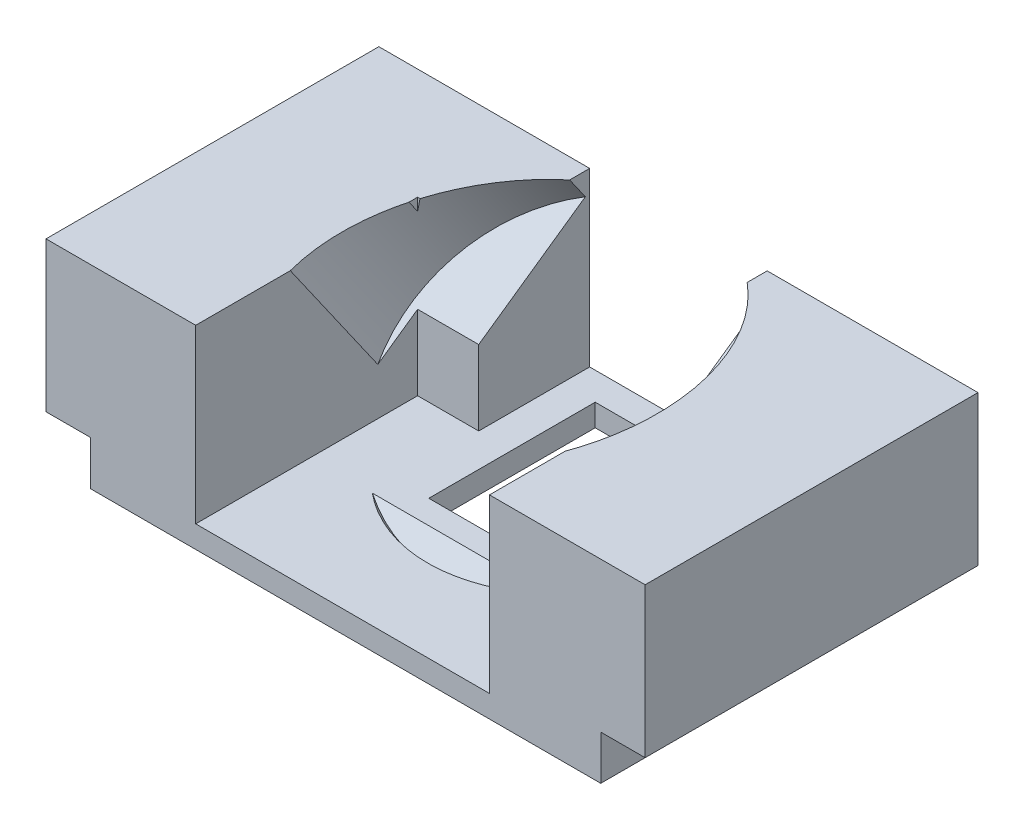
ISO-10303-21;
HEADER;
FILE_DESCRIPTION(('STEP AP214'),'2;1');
FILE_NAME('part.step','',(''),(''),'','','');
FILE_SCHEMA(('AUTOMOTIVE_DESIGN { 1 0 10303 214 1 1 1 1 }'));
ENDSEC;
DATA;
#1=APPLICATION_CONTEXT('core data for automotive mechanical design processes');
#2=APPLICATION_PROTOCOL_DEFINITION('international standard','automotive_design',2000,#1);
#3=PRODUCT_CONTEXT('',#1,'mechanical');
#4=PRODUCT('Part','Part','',(#3));
#5=PRODUCT_RELATED_PRODUCT_CATEGORY('part','',(#4));
#6=PRODUCT_DEFINITION_FORMATION('','',#4);
#7=PRODUCT_DEFINITION_CONTEXT('part definition',#1,'design');
#8=PRODUCT_DEFINITION('design','',#6,#7);
#9=PRODUCT_DEFINITION_SHAPE('','',#8);
#10=(LENGTH_UNIT() NAMED_UNIT(*) SI_UNIT(.MILLI.,.METRE.));
#11=(NAMED_UNIT(*) PLANE_ANGLE_UNIT() SI_UNIT($,.RADIAN.));
#12=(NAMED_UNIT(*) SI_UNIT($,.STERADIAN.) SOLID_ANGLE_UNIT());
#13=UNCERTAINTY_MEASURE_WITH_UNIT(LENGTH_MEASURE(1.E-05),#10,'distance_accuracy_value','');
#14=(GEOMETRIC_REPRESENTATION_CONTEXT(3) GLOBAL_UNCERTAINTY_ASSIGNED_CONTEXT((#13)) GLOBAL_UNIT_ASSIGNED_CONTEXT((#10,
#11,#12)) REPRESENTATION_CONTEXT('',''));
#15=CARTESIAN_POINT('',(0.,0.,0.));
#16=DIRECTION('',(0.,0.,1.));
#17=DIRECTION('',(1.,0.,0.));
#18=AXIS2_PLACEMENT_3D('',#15,#16,#17);
#19=CARTESIAN_POINT('',(34.29,11.1125,25.4));
#20=DIRECTION('',(0.,-1.,0.));
#21=DIRECTION('',(0.,0.,-1.));
#22=AXIS2_PLACEMENT_3D('',#19,#20,#21);
#23=PLANE('',#22);
#24=DIRECTION('',(0.,0.,-1.));
#25=VECTOR('',#24,1.);
#26=CARTESIAN_POINT('',(-17.1540385072498,11.1125,25.4));
#27=LINE('',#26,#25);
#28=CARTESIAN_POINT('',(-17.1540385072498,11.1125,25.4));
#29=VERTEX_POINT('',#28);
#30=CARTESIAN_POINT('',(-17.1540385072498,11.1125,14.5741067771752));
#31=VERTEX_POINT('',#30);
#32=EDGE_CURVE('E232',#29,#31,#27,.T.);
#33=ORIENTED_EDGE('',*,*,#32,.T.);
#34=CARTESIAN_POINT('',(0.,11.1125,7.78105626835542));
#35=DIRECTION('',(0.,-1.,0.));
#36=DIRECTION('',(0.,0.,-1.));
#37=AXIS2_PLACEMENT_3D('',#34,#35,#36);
#38=ELLIPSE('',#37,22.0154489337241,18.034);
#39=CARTESIAN_POINT('',(-17.1540385072498,11.1125,0.988005759535643));
#40=VERTEX_POINT('',#39);
#41=EDGE_CURVE('E367',#40,#31,#38,.F.);
#42=ORIENTED_EDGE('',*,*,#41,.F.);
#43=CARTESIAN_POINT('',(-17.1540385072498,11.1125,0.));
#44=VERTEX_POINT('',#43);
#45=EDGE_CURVE('E492',#40,#44,#27,.T.);
#46=ORIENTED_EDGE('',*,*,#45,.T.);
#47=DIRECTION('',(-1.,0.,0.));
#48=VECTOR('',#47,1.);
#49=CARTESIAN_POINT('',(-17.1540385072498,11.1125,0.));
#50=LINE('',#49,#48);
#51=CARTESIAN_POINT('',(-16.8700610793141,11.1125,0.));
#52=VERTEX_POINT('',#51);
#53=EDGE_CURVE('E233',#52,#44,#50,.T.);
#54=ORIENTED_EDGE('',*,*,#53,.F.);
#55=CARTESIAN_POINT('',(-10.16,11.1125,-10.4080572545341));
#56=VERTEX_POINT('',#55);
#57=EDGE_CURVE('E370',#56,#52,#38,.F.);
#58=ORIENTED_EDGE('',*,*,#57,.F.);
#59=DIRECTION('',(0.,0.,1.));
#60=VECTOR('',#59,1.);
#61=CARTESIAN_POINT('',(-10.16,11.1125,-25.4));
#62=LINE('',#61,#60);
#63=CARTESIAN_POINT('',(-10.16,11.1125,-12.7));
#64=VERTEX_POINT('',#63);
#65=EDGE_CURVE('E346',#64,#56,#62,.T.);
#66=ORIENTED_EDGE('',*,*,#65,.F.);
#67=DIRECTION('',(1.,0.,0.));
#68=VECTOR('',#67,1.);
#69=CARTESIAN_POINT('',(-34.29,11.1125,-12.7));
#70=LINE('',#69,#68);
#71=CARTESIAN_POINT('',(-34.29,11.1125,-12.7));
#72=VERTEX_POINT('',#71);
#73=EDGE_CURVE('E313',#72,#64,#70,.T.);
#74=ORIENTED_EDGE('',*,*,#73,.F.);
#75=DIRECTION('',(0.,0.,1.));
#76=VECTOR('',#75,1.);
#77=CARTESIAN_POINT('',(-34.29,11.1125,25.4));
#78=LINE('',#77,#76);
#79=CARTESIAN_POINT('',(-34.29,11.1125,25.4));
#80=VERTEX_POINT('',#79);
#81=EDGE_CURVE('E379',#72,#80,#78,.T.);
#82=ORIENTED_EDGE('',*,*,#81,.T.);
#83=DIRECTION('',(-1.,0.,0.));
#84=VECTOR('',#83,1.);
#85=CARTESIAN_POINT('',(34.29,11.1125,25.4));
#86=LINE('',#85,#84);
#87=EDGE_CURVE('E386',#29,#80,#86,.T.);
#88=ORIENTED_EDGE('',*,*,#87,.F.);
#89=EDGE_LOOP('',(#33,#42,#46,#54,#58,#66,#74,#82,#88));
#90=FACE_BOUND('',#89,.T.);
#91=ADVANCED_FACE('F33',(#90),#23,.F.);
#92=CARTESIAN_POINT('',(0.,19.3906957053343,13.5775113040057));
#93=DIRECTION('',(0.,-0.819152044288991,-0.573576436351047));
#94=DIRECTION('',(0.,0.573576436351047,-0.819152044288991));
#95=AXIS2_PLACEMENT_3D('',#92,#93,#94);
#96=CYLINDRICAL_SURFACE('',#95,18.034);
#97=ORIENTED_EDGE('',*,*,#41,.T.);
#98=DIRECTION('',(0.,-0.819152044288991,-0.573576436351047));
#99=VECTOR('',#98,1.);
#100=CARTESIAN_POINT('',(-17.1540385072498,16.1990059874523,18.1357166127382));
#101=LINE('',#100,#99);
#102=CARTESIAN_POINT('',(-17.1540385072498,-3.19168971788196,4.55820530873241));
#103=VERTEX_POINT('',#102);
#104=EDGE_CURVE('E266',#31,#103,#101,.T.);
#105=ORIENTED_EDGE('',*,*,#104,.T.);
#106=CARTESIAN_POINT('',(0.,0.,0.));
#107=DIRECTION('',(0.,0.819152044288991,0.573576436351047));
#108=DIRECTION('',(0.,-0.573576436351047,0.819152044288991));
#109=AXIS2_PLACEMENT_3D('',#106,#107,#108);
#110=CIRCLE('',#109,18.034);
#111=CARTESIAN_POINT('',(-10.16,8.54608787804823,-12.2050783684775));
#112=VERTEX_POINT('',#111);
#113=EDGE_CURVE('E365',#112,#103,#110,.T.);
#114=ORIENTED_EDGE('',*,*,#113,.F.);
#115=DIRECTION('',(0.,-0.819152044288991,-0.573576436351047));
#116=VECTOR('',#115,1.);
#117=CARTESIAN_POINT('',(-10.16,27.9367835833825,1.37243293552826));
#118=LINE('',#117,#116);
#119=EDGE_CURVE('E360',#56,#112,#118,.T.);
#120=ORIENTED_EDGE('',*,*,#119,.F.);
#121=ORIENTED_EDGE('',*,*,#57,.T.);
#122=CARTESIAN_POINT('',(0.,0.,0.));
#123=DIRECTION('',(0.,0.,1.));
#124=DIRECTION('',(0.,-1.,0.));
#125=AXIS2_PLACEMENT_3D('',#122,#123,#124);
#126=ELLIPSE('',#125,31.4413195122308,18.034);
#127=CARTESIAN_POINT('',(-17.1540385072498,9.70148154386947,0.));
#128=VERTEX_POINT('',#127);
#129=EDGE_CURVE('E254',#52,#128,#126,.T.);
#130=ORIENTED_EDGE('',*,*,#129,.T.);
#131=DIRECTION('',(0.,-0.819152044288991,-0.573576436351047));
#132=VECTOR('',#131,1.);
#133=CARTESIAN_POINT('',(-17.1540385072498,22.5823854232162,9.01930599527334));
#134=LINE('',#133,#132);
#135=EDGE_CURVE('E269',#128,#40,#134,.F.);
#136=ORIENTED_EDGE('',*,*,#135,.T.);
#137=EDGE_LOOP('',(#97,#105,#114,#120,#121,#130,#136));
#138=FACE_BOUND('',#137,.T.);
#139=ADVANCED_FACE('F436',(#138),#96,.F.);
#140=CARTESIAN_POINT('',(16.4712907059663,-4.21185337805134,6.01515000655404));
#141=VERTEX_POINT('',#140);
#142=CARTESIAN_POINT('',(10.16,8.54608787804823,-12.2050783684775));
#143=VERTEX_POINT('',#142);
#144=EDGE_CURVE('E366',#141,#143,#110,.T.);
#145=ORIENTED_EDGE('',*,*,#144,.F.);
#146=DIRECTION('',(0.,-0.819152044288991,-0.573576436351047));
#147=VECTOR('',#146,1.);
#148=CARTESIAN_POINT('',(16.4712907059663,15.1788423272829,19.5926613105598));
#149=LINE('',#148,#147);
#150=CARTESIAN_POINT('',(16.4712907059663,11.1125,16.745377760055));
#151=VERTEX_POINT('',#150);
#152=EDGE_CURVE('E260',#141,#151,#149,.F.);
#153=ORIENTED_EDGE('',*,*,#152,.T.);
#154=CARTESIAN_POINT('',(10.16,11.1125,-10.4080572545341));
#155=VERTEX_POINT('',#154);
#156=EDGE_CURVE('E371',#151,#155,#38,.F.);
#157=ORIENTED_EDGE('',*,*,#156,.T.);
#158=DIRECTION('',(0.,-0.819152044288991,-0.573576436351047));
#159=VECTOR('',#158,1.);
#160=CARTESIAN_POINT('',(10.16,27.9367835833825,1.37243293552826));
#161=LINE('',#160,#159);
#162=EDGE_CURVE('E357',#143,#155,#161,.F.);
#163=ORIENTED_EDGE('',*,*,#162,.F.);
#164=EDGE_LOOP('',(#145,#153,#157,#163));
#165=FACE_BOUND('',#164,.T.);
#166=ADVANCED_FACE('F444',(#165),#96,.F.);
#167=CARTESIAN_POINT('',(0.,0.,0.));
#168=DIRECTION('',(0.,0.819152044288991,0.573576436351047));
#169=DIRECTION('',(0.,-0.573576436351047,0.819152044288991));
#170=AXIS2_PLACEMENT_3D('',#167,#168,#169);
#171=PLANE('',#170);
#172=ORIENTED_EDGE('',*,*,#113,.T.);
#173=DIRECTION('',(0.,0.573576436351047,-0.819152044288991));
#174=VECTOR('',#173,1.);
#175=CARTESIAN_POINT('',(-17.1540385072498,0.,0.));
#176=LINE('',#175,#174);
#177=CARTESIAN_POINT('',(-17.1540385072498,0.,0.));
#178=VERTEX_POINT('',#177);
#179=EDGE_CURVE('E263',#103,#178,#176,.T.);
#180=ORIENTED_EDGE('',*,*,#179,.T.);
#181=DIRECTION('',(1.,0.,0.));
#182=VECTOR('',#181,1.);
#183=CARTESIAN_POINT('',(0.,0.,0.));
#184=LINE('',#183,#182);
#185=CARTESIAN_POINT('',(-10.16,0.,0.));
#186=VERTEX_POINT('',#185);
#187=EDGE_CURVE('E251',#178,#186,#184,.T.);
#188=ORIENTED_EDGE('',*,*,#187,.T.);
#189=DIRECTION('',(0.,-0.573576436351047,0.819152044288991));
#190=VECTOR('',#189,1.);
#191=CARTESIAN_POINT('',(-10.16,0.,0.));
#192=LINE('',#191,#190);
#193=EDGE_CURVE('E394',#112,#186,#192,.T.);
#194=ORIENTED_EDGE('',*,*,#193,.F.);
#195=EDGE_LOOP('',(#172,#180,#188,#194));
#196=FACE_BOUND('',#195,.T.);
#197=ADVANCED_FACE('F457',(#196),#171,.T.);
#198=DIRECTION('',(1.,0.,0.));
#199=VECTOR('',#198,1.);
#200=CARTESIAN_POINT('',(0.,0.,0.));
#201=LINE('',#200,#199);
#202=CARTESIAN_POINT('',(10.16,0.,0.));
#203=VERTEX_POINT('',#202);
#204=CARTESIAN_POINT('',(16.4712907059663,0.,0.));
#205=VERTEX_POINT('',#204);
#206=EDGE_CURVE('E55',#203,#205,#201,.T.);
#207=ORIENTED_EDGE('',*,*,#206,.T.);
#208=DIRECTION('',(0.,-0.573576436351047,0.819152044288991));
#209=VECTOR('',#208,1.);
#210=CARTESIAN_POINT('',(16.4712907059663,0.,0.));
#211=LINE('',#210,#209);
#212=EDGE_CURVE('E257',#205,#141,#211,.T.);
#213=ORIENTED_EDGE('',*,*,#212,.T.);
#214=ORIENTED_EDGE('',*,*,#144,.T.);
#215=DIRECTION('',(0.,0.573576436351047,-0.819152044288991));
#216=VECTOR('',#215,1.);
#217=CARTESIAN_POINT('',(10.16,0.,0.));
#218=LINE('',#217,#216);
#219=EDGE_CURVE('E391',#203,#143,#218,.T.);
#220=ORIENTED_EDGE('',*,*,#219,.F.);
#221=EDGE_LOOP('',(#207,#213,#214,#220));
#222=FACE_BOUND('',#221,.T.);
#223=ADVANCED_FACE('F449',(#222),#171,.T.);
#224=DIRECTION('',(0.,0.,-1.));
#225=VECTOR('',#224,1.);
#226=CARTESIAN_POINT('',(16.4712907059663,11.1125,25.4));
#227=LINE('',#226,#225);
#228=CARTESIAN_POINT('',(16.4712907059663,11.1125,25.4));
#229=VERTEX_POINT('',#228);
#230=EDGE_CURVE('E244',#229,#151,#227,.T.);
#231=ORIENTED_EDGE('',*,*,#230,.F.);
#232=CARTESIAN_POINT('',(34.29,11.1125,25.4));
#233=VERTEX_POINT('',#232);
#234=EDGE_CURVE('E387',#233,#229,#86,.T.);
#235=ORIENTED_EDGE('',*,*,#234,.F.);
#236=DIRECTION('',(0.,0.,1.));
#237=VECTOR('',#236,1.);
#238=CARTESIAN_POINT('',(34.29,11.1125,25.4));
#239=LINE('',#238,#237);
#240=CARTESIAN_POINT('',(34.29,11.1125,-12.7));
#241=VERTEX_POINT('',#240);
#242=EDGE_CURVE('E372',#241,#233,#239,.T.);
#243=ORIENTED_EDGE('',*,*,#242,.F.);
#244=CARTESIAN_POINT('',(10.16,11.1125,-12.7));
#245=VERTEX_POINT('',#244);
#246=EDGE_CURVE('E289',#245,#241,#70,.T.);
#247=ORIENTED_EDGE('',*,*,#246,.F.);
#248=DIRECTION('',(0.,0.,1.));
#249=VECTOR('',#248,1.);
#250=CARTESIAN_POINT('',(10.16,11.1125,-25.4));
#251=LINE('',#250,#249);
#252=EDGE_CURVE('E349',#245,#155,#251,.T.);
#253=ORIENTED_EDGE('',*,*,#252,.T.);
#254=ORIENTED_EDGE('',*,*,#156,.F.);
#255=EDGE_LOOP('',(#231,#235,#243,#247,#253,#254));
#256=FACE_BOUND('',#255,.T.);
#257=ADVANCED_FACE('F438',(#256),#23,.F.);
#258=CARTESIAN_POINT('',(34.29,11.1125,25.4));
#259=DIRECTION('',(0.,0.,-1.));
#260=DIRECTION('',(0.,1.,0.));
#261=AXIS2_PLACEMENT_3D('',#258,#259,#260);
#262=PLANE('',#261);
#263=DIRECTION('',(0.,-1.,0.));
#264=VECTOR('',#263,1.);
#265=CARTESIAN_POINT('',(-17.1540385072498,11.1125,25.4));
#266=LINE('',#265,#264);
#267=CARTESIAN_POINT('',(-17.1540385072498,-8.5725,25.4));
#268=VERTEX_POINT('',#267);
#269=EDGE_CURVE('E215',#29,#268,#266,.T.);
#270=ORIENTED_EDGE('',*,*,#269,.F.);
#271=ORIENTED_EDGE('',*,*,#87,.T.);
#272=DIRECTION('',(0.,-1.,0.));
#273=VECTOR('',#272,1.);
#274=CARTESIAN_POINT('',(-34.29,11.1125,25.4));
#275=LINE('',#274,#273);
#276=CARTESIAN_POINT('',(-34.29,-6.0325,25.4));
#277=VERTEX_POINT('',#276);
#278=EDGE_CURVE('E375',#80,#277,#275,.T.);
#279=ORIENTED_EDGE('',*,*,#278,.T.);
#280=DIRECTION('',(-1.,0.,0.));
#281=VECTOR('',#280,1.);
#282=CARTESIAN_POINT('',(-34.29,-6.0325,25.4));
#283=LINE('',#282,#281);
#284=CARTESIAN_POINT('',(-29.21,-6.0325,25.4));
#285=VERTEX_POINT('',#284);
#286=EDGE_CURVE('E276',#285,#277,#283,.T.);
#287=ORIENTED_EDGE('',*,*,#286,.F.);
#288=DIRECTION('',(0.,1.,0.));
#289=VECTOR('',#288,1.);
#290=CARTESIAN_POINT('',(-29.21,-11.1125,25.4));
#291=LINE('',#290,#289);
#292=CARTESIAN_POINT('',(-29.21,-11.1125,25.4));
#293=VERTEX_POINT('',#292);
#294=EDGE_CURVE('E273',#293,#285,#291,.T.);
#295=ORIENTED_EDGE('',*,*,#294,.F.);
#296=DIRECTION('',(-1.,0.,0.));
#297=VECTOR('',#296,1.);
#298=CARTESIAN_POINT('',(34.29,-11.1125,25.4));
#299=LINE('',#298,#297);
#300=CARTESIAN_POINT('',(29.21,-11.1125,25.4));
#301=VERTEX_POINT('',#300);
#302=EDGE_CURVE('E378',#301,#293,#299,.T.);
#303=ORIENTED_EDGE('',*,*,#302,.F.);
#304=DIRECTION('',(0.,-1.,0.));
#305=VECTOR('',#304,1.);
#306=CARTESIAN_POINT('',(29.21,-11.1125,25.4));
#307=LINE('',#306,#305);
#308=CARTESIAN_POINT('',(29.21,-6.0325,25.4));
#309=VERTEX_POINT('',#308);
#310=EDGE_CURVE('E295',#309,#301,#307,.T.);
#311=ORIENTED_EDGE('',*,*,#310,.F.);
#312=DIRECTION('',(-1.,0.,0.));
#313=VECTOR('',#312,1.);
#314=CARTESIAN_POINT('',(34.29,-6.0325,25.4));
#315=LINE('',#314,#313);
#316=CARTESIAN_POINT('',(34.29,-6.0325,25.4));
#317=VERTEX_POINT('',#316);
#318=EDGE_CURVE('E272',#317,#309,#315,.T.);
#319=ORIENTED_EDGE('',*,*,#318,.F.);
#320=DIRECTION('',(0.,-1.,0.));
#321=VECTOR('',#320,1.);
#322=CARTESIAN_POINT('',(34.29,11.1125,25.4));
#323=LINE('',#322,#321);
#324=EDGE_CURVE('E374',#233,#317,#323,.T.);
#325=ORIENTED_EDGE('',*,*,#324,.F.);
#326=ORIENTED_EDGE('',*,*,#234,.T.);
#327=DIRECTION('',(0.,1.,0.));
#328=VECTOR('',#327,1.);
#329=CARTESIAN_POINT('',(16.4712907059663,11.1125,25.4));
#330=LINE('',#329,#328);
#331=CARTESIAN_POINT('',(16.4712907059663,-8.5725,25.4));
#332=VERTEX_POINT('',#331);
#333=EDGE_CURVE('E218',#332,#229,#330,.T.);
#334=ORIENTED_EDGE('',*,*,#333,.F.);
#335=DIRECTION('',(1.,0.,0.));
#336=VECTOR('',#335,1.);
#337=CARTESIAN_POINT('',(-10.16,-8.5725,25.4));
#338=LINE('',#337,#336);
#339=EDGE_CURVE('E212',#268,#332,#338,.T.);
#340=ORIENTED_EDGE('',*,*,#339,.F.);
#341=EDGE_LOOP('',(#270,#271,#279,#287,#295,#303,#311,#319,#325,#326,#334,#340));
#342=FACE_BOUND('',#341,.T.);
#343=ADVANCED_FACE('F214',(#342),#262,.F.);
#344=CARTESIAN_POINT('',(-10.16,-8.5725,-25.4));
#345=DIRECTION('',(-1.,0.,0.));
#346=DIRECTION('',(0.,0.,1.));
#347=AXIS2_PLACEMENT_3D('',#344,#345,#346);
#348=PLANE('',#347);
#349=DIRECTION('',(0.,1.,0.));
#350=VECTOR('',#349,1.);
#351=CARTESIAN_POINT('',(-10.16,-8.5725,0.));
#352=LINE('',#351,#350);
#353=CARTESIAN_POINT('',(-10.16,-8.5725,0.));
#354=VERTEX_POINT('',#353);
#355=EDGE_CURVE('E249',#354,#186,#352,.T.);
#356=ORIENTED_EDGE('',*,*,#355,.F.);
#357=DIRECTION('',(0.,0.,1.));
#358=VECTOR('',#357,1.);
#359=CARTESIAN_POINT('',(-10.16,-8.5725,-25.4));
#360=LINE('',#359,#358);
#361=CARTESIAN_POINT('',(-10.16,-8.5725,-12.7));
#362=VERTEX_POINT('',#361);
#363=EDGE_CURVE('E223',#362,#354,#360,.T.);
#364=ORIENTED_EDGE('',*,*,#363,.F.);
#365=DIRECTION('',(0.,1.,0.));
#366=VECTOR('',#365,1.);
#367=CARTESIAN_POINT('',(-10.16,-8.5725,-12.7));
#368=LINE('',#367,#366);
#369=EDGE_CURVE('E321',#362,#64,#368,.T.);
#370=ORIENTED_EDGE('',*,*,#369,.T.);
#371=ORIENTED_EDGE('',*,*,#65,.T.);
#372=ORIENTED_EDGE('',*,*,#119,.T.);
#373=ORIENTED_EDGE('',*,*,#193,.T.);
#374=EDGE_LOOP('',(#356,#364,#370,#371,#372,#373));
#375=FACE_BOUND('',#374,.T.);
#376=ADVANCED_FACE('F455',(#375),#348,.F.);
#377=CARTESIAN_POINT('',(10.16,-8.5725,-25.4));
#378=DIRECTION('',(1.,0.,0.));
#379=DIRECTION('',(0.,0.,-1.));
#380=AXIS2_PLACEMENT_3D('',#377,#378,#379);
#381=PLANE('',#380);
#382=DIRECTION('',(0.,-1.,0.));
#383=VECTOR('',#382,1.);
#384=CARTESIAN_POINT('',(10.16,-8.5725,0.));
#385=LINE('',#384,#383);
#386=CARTESIAN_POINT('',(10.16,-8.5725,0.));
#387=VERTEX_POINT('',#386);
#388=EDGE_CURVE('E240',#203,#387,#385,.T.);
#389=ORIENTED_EDGE('',*,*,#388,.F.);
#390=ORIENTED_EDGE('',*,*,#219,.T.);
#391=ORIENTED_EDGE('',*,*,#162,.T.);
#392=ORIENTED_EDGE('',*,*,#252,.F.);
#393=DIRECTION('',(0.,-1.,0.));
#394=VECTOR('',#393,1.);
#395=CARTESIAN_POINT('',(10.16,-8.5725,-12.7));
#396=LINE('',#395,#394);
#397=CARTESIAN_POINT('',(10.16,-8.5725,-12.7));
#398=VERTEX_POINT('',#397);
#399=EDGE_CURVE('E317',#245,#398,#396,.T.);
#400=ORIENTED_EDGE('',*,*,#399,.T.);
#401=DIRECTION('',(0.,0.,1.));
#402=VECTOR('',#401,1.);
#403=CARTESIAN_POINT('',(10.16,-8.5725,-25.4));
#404=LINE('',#403,#402);
#405=EDGE_CURVE('E352',#398,#387,#404,.T.);
#406=ORIENTED_EDGE('',*,*,#405,.T.);
#407=EDGE_LOOP('',(#389,#390,#391,#392,#400,#406));
#408=FACE_BOUND('',#407,.T.);
#409=ADVANCED_FACE('F477',(#408),#381,.F.);
#410=CARTESIAN_POINT('',(34.29,-11.1125,25.4));
#411=DIRECTION('',(0.,1.,0.));
#412=DIRECTION('',(0.,0.,1.));
#413=AXIS2_PLACEMENT_3D('',#410,#411,#412);
#414=PLANE('',#413);
#415=DIRECTION('',(-1.,0.,0.));
#416=VECTOR('',#415,1.);
#417=CARTESIAN_POINT('',(6.35,-11.1125,-9.52500000000001));
#418=LINE('',#417,#416);
#419=CARTESIAN_POINT('',(6.35,-11.1125,-9.52500000000001));
#420=VERTEX_POINT('',#419);
#421=CARTESIAN_POINT('',(-6.35,-11.1125,-9.525));
#422=VERTEX_POINT('',#421);
#423=EDGE_CURVE('E333',#420,#422,#418,.T.);
#424=ORIENTED_EDGE('',*,*,#423,.T.);
#425=DIRECTION('',(0.,0.,1.));
#426=VECTOR('',#425,1.);
#427=CARTESIAN_POINT('',(-6.35,-11.1125,-9.525));
#428=LINE('',#427,#426);
#429=CARTESIAN_POINT('',(-6.34999999999999,-11.1125,9.525));
#430=VERTEX_POINT('',#429);
#431=EDGE_CURVE('E324',#422,#430,#428,.T.);
#432=ORIENTED_EDGE('',*,*,#431,.T.);
#433=DIRECTION('',(1.,0.,0.));
#434=VECTOR('',#433,1.);
#435=CARTESIAN_POINT('',(6.35000000000001,-11.1125,9.525));
#436=LINE('',#435,#434);
#437=CARTESIAN_POINT('',(6.35,-11.1125,9.525));
#438=VERTEX_POINT('',#437);
#439=EDGE_CURVE('E327',#430,#438,#436,.T.);
#440=ORIENTED_EDGE('',*,*,#439,.T.);
#441=DIRECTION('',(0.,0.,-1.));
#442=VECTOR('',#441,1.);
#443=CARTESIAN_POINT('',(6.35,-11.1125,-9.52500000000001));
#444=LINE('',#443,#442);
#445=EDGE_CURVE('E330',#438,#420,#444,.T.);
#446=ORIENTED_EDGE('',*,*,#445,.T.);
#447=EDGE_LOOP('',(#424,#432,#440,#446));
#448=FACE_BOUND('',#447,.T.);
#449=ORIENTED_EDGE('',*,*,#302,.T.);
#450=DIRECTION('',(0.,0.,1.));
#451=VECTOR('',#450,1.);
#452=CARTESIAN_POINT('',(-29.21,-11.1125,-12.7));
#453=LINE('',#452,#451);
#454=CARTESIAN_POINT('',(-29.21,-11.1125,-12.7));
#455=VERTEX_POINT('',#454);
#456=EDGE_CURVE('E285',#455,#293,#453,.T.);
#457=ORIENTED_EDGE('',*,*,#456,.F.);
#458=DIRECTION('',(1.,0.,0.));
#459=VECTOR('',#458,1.);
#460=CARTESIAN_POINT('',(-34.29,-11.1125,-12.7));
#461=LINE('',#460,#459);
#462=CARTESIAN_POINT('',(29.21,-11.1125,-12.7));
#463=VERTEX_POINT('',#462);
#464=EDGE_CURVE('E309',#455,#463,#461,.T.);
#465=ORIENTED_EDGE('',*,*,#464,.T.);
#466=DIRECTION('',(0.,0.,1.));
#467=VECTOR('',#466,1.);
#468=CARTESIAN_POINT('',(29.21,-11.1125,-12.7));
#469=LINE('',#468,#467);
#470=EDGE_CURVE('E277',#463,#301,#469,.T.);
#471=ORIENTED_EDGE('',*,*,#470,.T.);
#472=EDGE_LOOP('',(#449,#457,#465,#471));
#473=FACE_BOUND('',#472,.T.);
#474=ADVANCED_FACE('F416',(#448,#473),#414,.F.);
#475=CARTESIAN_POINT('',(34.29,0.,0.));
#476=DIRECTION('',(1.,0.,0.));
#477=DIRECTION('',(0.,0.,-1.));
#478=AXIS2_PLACEMENT_3D('',#475,#476,#477);
#479=PLANE('',#478);
#480=DIRECTION('',(0.,0.,1.));
#481=VECTOR('',#480,1.);
#482=CARTESIAN_POINT('',(34.29,-6.0325,-12.7));
#483=LINE('',#482,#481);
#484=CARTESIAN_POINT('',(34.29,-6.0325,-12.7));
#485=VERTEX_POINT('',#484);
#486=EDGE_CURVE('E303',#485,#317,#483,.T.);
#487=ORIENTED_EDGE('',*,*,#486,.F.);
#488=DIRECTION('',(0.,1.,0.));
#489=VECTOR('',#488,1.);
#490=CARTESIAN_POINT('',(34.29,-11.1125,-12.7));
#491=LINE('',#490,#489);
#492=EDGE_CURVE('E315',#485,#241,#491,.T.);
#493=ORIENTED_EDGE('',*,*,#492,.T.);
#494=ORIENTED_EDGE('',*,*,#242,.T.);
#495=ORIENTED_EDGE('',*,*,#324,.T.);
#496=EDGE_LOOP('',(#487,#493,#494,#495));
#497=FACE_BOUND('',#496,.T.);
#498=ADVANCED_FACE('F471',(#497),#479,.T.);
#499=CARTESIAN_POINT('',(-34.29,0.,0.));
#500=DIRECTION('',(1.,0.,0.));
#501=DIRECTION('',(0.,0.,-1.));
#502=AXIS2_PLACEMENT_3D('',#499,#500,#501);
#503=PLANE('',#502);
#504=DIRECTION('',(0.,1.,0.));
#505=VECTOR('',#504,1.);
#506=CARTESIAN_POINT('',(-34.29,-11.1125,-12.7));
#507=LINE('',#506,#505);
#508=CARTESIAN_POINT('',(-34.29,-6.0325,-12.7));
#509=VERTEX_POINT('',#508);
#510=EDGE_CURVE('E312',#509,#72,#507,.T.);
#511=ORIENTED_EDGE('',*,*,#510,.F.);
#512=DIRECTION('',(0.,0.,1.));
#513=VECTOR('',#512,1.);
#514=CARTESIAN_POINT('',(-34.29,-6.0325,-12.7));
#515=LINE('',#514,#513);
#516=EDGE_CURVE('E286',#509,#277,#515,.T.);
#517=ORIENTED_EDGE('',*,*,#516,.T.);
#518=ORIENTED_EDGE('',*,*,#278,.F.);
#519=ORIENTED_EDGE('',*,*,#81,.F.);
#520=EDGE_LOOP('',(#511,#517,#518,#519));
#521=FACE_BOUND('',#520,.T.);
#522=ADVANCED_FACE('F518',(#521),#503,.F.);
#523=CARTESIAN_POINT('',(-10.16,-8.5725,-25.4));
#524=DIRECTION('',(0.,-1.,0.));
#525=DIRECTION('',(0.,0.,-1.));
#526=AXIS2_PLACEMENT_3D('',#523,#524,#525);
#527=PLANE('',#526);
#528=DIRECTION('',(0.,0.,1.));
#529=VECTOR('',#528,1.);
#530=CARTESIAN_POINT('',(6.35,-8.5725,-25.4));
#531=LINE('',#530,#529);
#532=CARTESIAN_POINT('',(6.35,-8.5725,-9.52500000000001));
#533=VERTEX_POINT('',#532);
#534=CARTESIAN_POINT('',(6.35000000000001,-8.5725,9.525));
#535=VERTEX_POINT('',#534);
#536=EDGE_CURVE('E400',#533,#535,#531,.T.);
#537=ORIENTED_EDGE('',*,*,#536,.T.);
#538=DIRECTION('',(-1.,0.,0.));
#539=VECTOR('',#538,1.);
#540=CARTESIAN_POINT('',(-10.16,-8.5725,9.525));
#541=LINE('',#540,#539);
#542=CARTESIAN_POINT('',(-6.34999999999999,-8.5725,9.525));
#543=VERTEX_POINT('',#542);
#544=EDGE_CURVE('E397',#535,#543,#541,.T.);
#545=ORIENTED_EDGE('',*,*,#544,.T.);
#546=DIRECTION('',(0.,0.,-1.));
#547=VECTOR('',#546,1.);
#548=CARTESIAN_POINT('',(-6.35,-8.5725,-25.4));
#549=LINE('',#548,#547);
#550=CARTESIAN_POINT('',(-6.35,-8.5725,-9.525));
#551=VERTEX_POINT('',#550);
#552=EDGE_CURVE('E40',#543,#551,#549,.T.);
#553=ORIENTED_EDGE('',*,*,#552,.T.);
#554=DIRECTION('',(1.,0.,0.));
#555=VECTOR('',#554,1.);
#556=CARTESIAN_POINT('',(-10.16,-8.5725,-9.525));
#557=LINE('',#556,#555);
#558=EDGE_CURVE('E402',#551,#533,#557,.T.);
#559=ORIENTED_EDGE('',*,*,#558,.T.);
#560=EDGE_LOOP('',(#537,#545,#553,#559));
#561=FACE_BOUND('',#560,.T.);
#562=ORIENTED_EDGE('',*,*,#339,.T.);
#563=DIRECTION('',(0.,0.,-1.));
#564=VECTOR('',#563,1.);
#565=CARTESIAN_POINT('',(16.4712907059663,-8.5725,25.4));
#566=LINE('',#565,#564);
#567=CARTESIAN_POINT('',(16.4712907059663,-8.5725,0.));
#568=VERTEX_POINT('',#567);
#569=EDGE_CURVE('E241',#332,#568,#566,.T.);
#570=ORIENTED_EDGE('',*,*,#569,.T.);
#571=DIRECTION('',(1.,0.,0.));
#572=VECTOR('',#571,1.);
#573=CARTESIAN_POINT('',(-17.1540385072498,-8.5725,0.));
#574=LINE('',#573,#572);
#575=EDGE_CURVE('E500',#387,#568,#574,.T.);
#576=ORIENTED_EDGE('',*,*,#575,.F.);
#577=ORIENTED_EDGE('',*,*,#405,.F.);
#578=DIRECTION('',(-1.,0.,0.));
#579=VECTOR('',#578,1.);
#580=CARTESIAN_POINT('',(-10.16,-8.5725,-12.7));
#581=LINE('',#580,#579);
#582=EDGE_CURVE('E11',#398,#362,#581,.T.);
#583=ORIENTED_EDGE('',*,*,#582,.T.);
#584=ORIENTED_EDGE('',*,*,#363,.T.);
#585=CARTESIAN_POINT('',(-17.1540385072498,-8.5725,0.));
#586=VERTEX_POINT('',#585);
#587=EDGE_CURVE('E239',#586,#354,#574,.T.);
#588=ORIENTED_EDGE('',*,*,#587,.F.);
#589=DIRECTION('',(0.,0.,-1.));
#590=VECTOR('',#589,1.);
#591=CARTESIAN_POINT('',(-17.1540385072498,-8.5725,25.4));
#592=LINE('',#591,#590);
#593=EDGE_CURVE('E230',#268,#586,#592,.T.);
#594=ORIENTED_EDGE('',*,*,#593,.F.);
#595=EDGE_LOOP('',(#562,#570,#576,#577,#583,#584,#588,#594));
#596=FACE_BOUND('',#595,.T.);
#597=CARTESIAN_POINT('',(0.,-8.5725,-6.00252912130275));
#598=DIRECTION('',(0.,-1.,0.));
#599=DIRECTION('',(0.,0.,-1.));
#600=AXIS2_PLACEMENT_3D('',#597,#598,#599);
#601=ELLIPSE('',#600,22.0154489337241,18.034);
#602=CARTESIAN_POINT('',(10.0921393961599,-8.5725,12.2427987877967));
#603=VERTEX_POINT('',#602);
#604=CARTESIAN_POINT('',(-10.0921393961599,-8.5725,12.2427987877967));
#605=VERTEX_POINT('',#604);
#606=EDGE_CURVE('E348',#603,#605,#601,.T.);
#607=ORIENTED_EDGE('',*,*,#606,.T.);
#608=DIRECTION('',(1.,0.,0.));
#609=VECTOR('',#608,1.);
#610=CARTESIAN_POINT('',(0.,-8.5725,12.2427987877967));
#611=LINE('',#610,#609);
#612=EDGE_CURVE('E389',#605,#603,#611,.T.);
#613=ORIENTED_EDGE('',*,*,#612,.T.);
#614=EDGE_LOOP('',(#607,#613));
#615=FACE_BOUND('',#614,.T.);
#616=ADVANCED_FACE('F236',(#561,#596,#615),#527,.F.);
#617=ORIENTED_EDGE('',*,*,#612,.F.);
#618=EDGE_CURVE('E362',#605,#603,#110,.T.);
#619=ORIENTED_EDGE('',*,*,#618,.T.);
#620=EDGE_LOOP('',(#617,#619));
#621=FACE_BOUND('',#620,.T.);
#622=ADVANCED_FACE('F460',(#621),#171,.T.);
#623=ORIENTED_EDGE('',*,*,#606,.F.);
#624=ORIENTED_EDGE('',*,*,#618,.F.);
#625=EDGE_LOOP('',(#623,#624));
#626=FACE_BOUND('',#625,.T.);
#627=ADVANCED_FACE('F447',(#626),#96,.F.);
#628=CARTESIAN_POINT('',(-6.35,-11.1125,-9.525));
#629=DIRECTION('',(-1.,0.,0.));
#630=DIRECTION('',(0.,0.,1.));
#631=AXIS2_PLACEMENT_3D('',#628,#629,#630);
#632=PLANE('',#631);
#633=DIRECTION('',(0.,1.,0.));
#634=VECTOR('',#633,1.);
#635=CARTESIAN_POINT('',(-6.34999999999999,-11.1125,9.525));
#636=LINE('',#635,#634);
#637=EDGE_CURVE('E336',#430,#543,#636,.T.);
#638=ORIENTED_EDGE('',*,*,#637,.F.);
#639=ORIENTED_EDGE('',*,*,#431,.F.);
#640=DIRECTION('',(0.,1.,0.));
#641=VECTOR('',#640,1.);
#642=CARTESIAN_POINT('',(-6.35,-11.1125,-9.525));
#643=LINE('',#642,#641);
#644=EDGE_CURVE('E224',#422,#551,#643,.T.);
#645=ORIENTED_EDGE('',*,*,#644,.T.);
#646=ORIENTED_EDGE('',*,*,#552,.F.);
#647=EDGE_LOOP('',(#638,#639,#645,#646));
#648=FACE_BOUND('',#647,.T.);
#649=ADVANCED_FACE('F413',(#648),#632,.F.);
#650=CARTESIAN_POINT('',(6.35,-11.1125,-9.52500000000001));
#651=DIRECTION('',(0.,0.,-1.));
#652=DIRECTION('',(-1.,0.,0.));
#653=AXIS2_PLACEMENT_3D('',#650,#651,#652);
#654=PLANE('',#653);
#655=ORIENTED_EDGE('',*,*,#644,.F.);
#656=ORIENTED_EDGE('',*,*,#423,.F.);
#657=DIRECTION('',(0.,1.,0.));
#658=VECTOR('',#657,1.);
#659=CARTESIAN_POINT('',(6.35,-11.1125,-9.52500000000001));
#660=LINE('',#659,#658);
#661=EDGE_CURVE('E339',#420,#533,#660,.T.);
#662=ORIENTED_EDGE('',*,*,#661,.T.);
#663=ORIENTED_EDGE('',*,*,#558,.F.);
#664=EDGE_LOOP('',(#655,#656,#662,#663));
#665=FACE_BOUND('',#664,.T.);
#666=ADVANCED_FACE('F410',(#665),#654,.F.);
#667=CARTESIAN_POINT('',(6.35,-11.1125,-9.52500000000001));
#668=DIRECTION('',(1.,0.,0.));
#669=DIRECTION('',(0.,0.,-1.));
#670=AXIS2_PLACEMENT_3D('',#667,#668,#669);
#671=PLANE('',#670);
#672=ORIENTED_EDGE('',*,*,#661,.F.);
#673=ORIENTED_EDGE('',*,*,#445,.F.);
#674=DIRECTION('',(0.,1.,0.));
#675=VECTOR('',#674,1.);
#676=CARTESIAN_POINT('',(6.35000000000001,-11.1125,9.525));
#677=LINE('',#676,#675);
#678=EDGE_CURVE('E342',#438,#535,#677,.T.);
#679=ORIENTED_EDGE('',*,*,#678,.T.);
#680=ORIENTED_EDGE('',*,*,#536,.F.);
#681=EDGE_LOOP('',(#672,#673,#679,#680));
#682=FACE_BOUND('',#681,.T.);
#683=ADVANCED_FACE('F420',(#682),#671,.F.);
#684=CARTESIAN_POINT('',(6.35000000000001,-11.1125,9.525));
#685=DIRECTION('',(0.,0.,1.));
#686=DIRECTION('',(1.,0.,0.));
#687=AXIS2_PLACEMENT_3D('',#684,#685,#686);
#688=PLANE('',#687);
#689=ORIENTED_EDGE('',*,*,#678,.F.);
#690=ORIENTED_EDGE('',*,*,#439,.F.);
#691=ORIENTED_EDGE('',*,*,#637,.T.);
#692=ORIENTED_EDGE('',*,*,#544,.F.);
#693=EDGE_LOOP('',(#689,#690,#691,#692));
#694=FACE_BOUND('',#693,.T.);
#695=ADVANCED_FACE('F422',(#694),#688,.F.);
#696=CARTESIAN_POINT('',(-34.29,-11.1125,-12.7));
#697=DIRECTION('',(0.,0.,1.));
#698=DIRECTION('',(1.,0.,0.));
#699=AXIS2_PLACEMENT_3D('',#696,#697,#698);
#700=PLANE('',#699);
#701=DIRECTION('',(0.,1.,0.));
#702=VECTOR('',#701,1.);
#703=CARTESIAN_POINT('',(-29.21,-11.1125,-12.7));
#704=LINE('',#703,#702);
#705=CARTESIAN_POINT('',(-29.21,-6.0325,-12.7));
#706=VERTEX_POINT('',#705);
#707=EDGE_CURVE('E279',#455,#706,#704,.T.);
#708=ORIENTED_EDGE('',*,*,#707,.T.);
#709=DIRECTION('',(-1.,0.,0.));
#710=VECTOR('',#709,1.);
#711=CARTESIAN_POINT('',(-34.29,-6.0325,-12.7));
#712=LINE('',#711,#710);
#713=EDGE_CURVE('E282',#706,#509,#712,.T.);
#714=ORIENTED_EDGE('',*,*,#713,.T.);
#715=ORIENTED_EDGE('',*,*,#510,.T.);
#716=ORIENTED_EDGE('',*,*,#73,.T.);
#717=ORIENTED_EDGE('',*,*,#369,.F.);
#718=ORIENTED_EDGE('',*,*,#582,.F.);
#719=ORIENTED_EDGE('',*,*,#399,.F.);
#720=ORIENTED_EDGE('',*,*,#246,.T.);
#721=ORIENTED_EDGE('',*,*,#492,.F.);
#722=DIRECTION('',(-1.,0.,0.));
#723=VECTOR('',#722,1.);
#724=CARTESIAN_POINT('',(34.29,-6.0325,-12.7));
#725=LINE('',#724,#723);
#726=CARTESIAN_POINT('',(29.21,-6.0325,-12.7));
#727=VERTEX_POINT('',#726);
#728=EDGE_CURVE('E297',#485,#727,#725,.T.);
#729=ORIENTED_EDGE('',*,*,#728,.T.);
#730=DIRECTION('',(0.,-1.,0.));
#731=VECTOR('',#730,1.);
#732=CARTESIAN_POINT('',(29.21,-11.1125,-12.7));
#733=LINE('',#732,#731);
#734=EDGE_CURVE('E300',#727,#463,#733,.T.);
#735=ORIENTED_EDGE('',*,*,#734,.T.);
#736=ORIENTED_EDGE('',*,*,#464,.F.);
#737=EDGE_LOOP('',(#708,#714,#715,#716,#717,#718,#719,#720,#721,#729,#735,#736));
#738=FACE_BOUND('',#737,.T.);
#739=ADVANCED_FACE('F424',(#738),#700,.F.);
#740=CARTESIAN_POINT('',(29.21,-11.1125,-12.7));
#741=DIRECTION('',(-1.,0.,0.));
#742=DIRECTION('',(0.,0.,1.));
#743=AXIS2_PLACEMENT_3D('',#740,#741,#742);
#744=PLANE('',#743);
#745=ORIENTED_EDGE('',*,*,#470,.F.);
#746=ORIENTED_EDGE('',*,*,#734,.F.);
#747=DIRECTION('',(0.,0.,1.));
#748=VECTOR('',#747,1.);
#749=CARTESIAN_POINT('',(29.21,-6.0325,-12.7));
#750=LINE('',#749,#748);
#751=EDGE_CURVE('E306',#727,#309,#750,.T.);
#752=ORIENTED_EDGE('',*,*,#751,.T.);
#753=ORIENTED_EDGE('',*,*,#310,.T.);
#754=EDGE_LOOP('',(#745,#746,#752,#753));
#755=FACE_BOUND('',#754,.T.);
#756=ADVANCED_FACE('F430',(#755),#744,.F.);
#757=CARTESIAN_POINT('',(34.29,-6.0325,-12.7));
#758=DIRECTION('',(0.,1.,0.));
#759=DIRECTION('',(0.,0.,1.));
#760=AXIS2_PLACEMENT_3D('',#757,#758,#759);
#761=PLANE('',#760);
#762=ORIENTED_EDGE('',*,*,#751,.F.);
#763=ORIENTED_EDGE('',*,*,#728,.F.);
#764=ORIENTED_EDGE('',*,*,#486,.T.);
#765=ORIENTED_EDGE('',*,*,#318,.T.);
#766=EDGE_LOOP('',(#762,#763,#764,#765));
#767=FACE_BOUND('',#766,.T.);
#768=ADVANCED_FACE('F532',(#767),#761,.F.);
#769=CARTESIAN_POINT('',(-34.29,-6.0325,-12.7));
#770=DIRECTION('',(0.,1.,0.));
#771=DIRECTION('',(0.,0.,1.));
#772=AXIS2_PLACEMENT_3D('',#769,#770,#771);
#773=PLANE('',#772);
#774=ORIENTED_EDGE('',*,*,#516,.F.);
#775=ORIENTED_EDGE('',*,*,#713,.F.);
#776=DIRECTION('',(0.,0.,1.));
#777=VECTOR('',#776,1.);
#778=CARTESIAN_POINT('',(-29.21,-6.0325,-12.7));
#779=LINE('',#778,#777);
#780=EDGE_CURVE('E290',#706,#285,#779,.T.);
#781=ORIENTED_EDGE('',*,*,#780,.T.);
#782=ORIENTED_EDGE('',*,*,#286,.T.);
#783=EDGE_LOOP('',(#774,#775,#781,#782));
#784=FACE_BOUND('',#783,.T.);
#785=ADVANCED_FACE('F523',(#784),#773,.F.);
#786=CARTESIAN_POINT('',(-29.21,-11.1125,-12.7));
#787=DIRECTION('',(1.,0.,0.));
#788=DIRECTION('',(0.,0.,-1.));
#789=AXIS2_PLACEMENT_3D('',#786,#787,#788);
#790=PLANE('',#789);
#791=ORIENTED_EDGE('',*,*,#780,.F.);
#792=ORIENTED_EDGE('',*,*,#707,.F.);
#793=ORIENTED_EDGE('',*,*,#456,.T.);
#794=ORIENTED_EDGE('',*,*,#294,.T.);
#795=EDGE_LOOP('',(#791,#792,#793,#794));
#796=FACE_BOUND('',#795,.T.);
#797=ADVANCED_FACE('F526',(#796),#790,.F.);
#798=CARTESIAN_POINT('',(0.,0.,0.));
#799=DIRECTION('',(0.,0.,1.));
#800=DIRECTION('',(1.,0.,0.));
#801=AXIS2_PLACEMENT_3D('',#798,#799,#800);
#802=PLANE('',#801);
#803=ORIENTED_EDGE('',*,*,#388,.T.);
#804=ORIENTED_EDGE('',*,*,#575,.T.);
#805=DIRECTION('',(0.,1.,0.));
#806=VECTOR('',#805,1.);
#807=CARTESIAN_POINT('',(16.4712907059663,11.1125,0.));
#808=LINE('',#807,#806);
#809=EDGE_CURVE('E493',#568,#205,#808,.T.);
#810=ORIENTED_EDGE('',*,*,#809,.T.);
#811=ORIENTED_EDGE('',*,*,#206,.F.);
#812=EDGE_LOOP('',(#803,#804,#810,#811));
#813=FACE_BOUND('',#812,.T.);
#814=ADVANCED_FACE('F505',(#813),#802,.T.);
#815=CARTESIAN_POINT('',(16.4712907059663,11.1125,25.4));
#816=DIRECTION('',(-1.,0.,0.));
#817=DIRECTION('',(0.,0.,1.));
#818=AXIS2_PLACEMENT_3D('',#815,#816,#817);
#819=PLANE('',#818);
#820=ORIENTED_EDGE('',*,*,#212,.F.);
#821=ORIENTED_EDGE('',*,*,#809,.F.);
#822=ORIENTED_EDGE('',*,*,#569,.F.);
#823=ORIENTED_EDGE('',*,*,#333,.T.);
#824=ORIENTED_EDGE('',*,*,#230,.T.);
#825=ORIENTED_EDGE('',*,*,#152,.F.);
#826=EDGE_LOOP('',(#820,#821,#822,#823,#824,#825));
#827=FACE_BOUND('',#826,.T.);
#828=ADVANCED_FACE('F507',(#827),#819,.T.);
#829=DIRECTION('',(0.,-1.,0.));
#830=VECTOR('',#829,1.);
#831=CARTESIAN_POINT('',(-17.1540385072498,11.1125,0.));
#832=LINE('',#831,#830);
#833=EDGE_CURVE('E501',#178,#586,#832,.T.);
#834=ORIENTED_EDGE('',*,*,#833,.T.);
#835=ORIENTED_EDGE('',*,*,#587,.T.);
#836=ORIENTED_EDGE('',*,*,#355,.T.);
#837=ORIENTED_EDGE('',*,*,#187,.F.);
#838=EDGE_LOOP('',(#834,#835,#836,#837));
#839=FACE_BOUND('',#838,.T.);
#840=ADVANCED_FACE('F511',(#839),#802,.T.);
#841=CARTESIAN_POINT('',(-17.1540385072498,11.1125,25.4));
#842=DIRECTION('',(1.,0.,0.));
#843=DIRECTION('',(0.,0.,-1.));
#844=AXIS2_PLACEMENT_3D('',#841,#842,#843);
#845=PLANE('',#844);
#846=ORIENTED_EDGE('',*,*,#32,.F.);
#847=ORIENTED_EDGE('',*,*,#269,.T.);
#848=ORIENTED_EDGE('',*,*,#593,.T.);
#849=ORIENTED_EDGE('',*,*,#833,.F.);
#850=ORIENTED_EDGE('',*,*,#179,.F.);
#851=ORIENTED_EDGE('',*,*,#104,.F.);
#852=EDGE_LOOP('',(#846,#847,#848,#849,#850,#851));
#853=FACE_BOUND('',#852,.T.);
#854=ADVANCED_FACE('F228',(#853),#845,.T.);
#855=EDGE_CURVE('E47',#44,#128,#832,.T.);
#856=ORIENTED_EDGE('',*,*,#855,.F.);
#857=ORIENTED_EDGE('',*,*,#45,.F.);
#858=ORIENTED_EDGE('',*,*,#135,.F.);
#859=EDGE_LOOP('',(#856,#857,#858));
#860=FACE_BOUND('',#859,.T.);
#861=ADVANCED_FACE('F632',(#860),#845,.T.);
#862=ORIENTED_EDGE('',*,*,#53,.T.);
#863=ORIENTED_EDGE('',*,*,#855,.T.);
#864=ORIENTED_EDGE('',*,*,#129,.F.);
#865=EDGE_LOOP('',(#862,#863,#864));
#866=FACE_BOUND('',#865,.T.);
#867=ADVANCED_FACE('F614',(#866),#802,.T.);
#868=CLOSED_SHELL('',(#91,#139,#166,#197,#223,#257,#343,#376,#409,#474,#498,#522,#616,#622,#627,
#649,#666,#683,#695,#739,#756,#768,#785,#797,#814,#828,#840,#854,#861,#867));
#869=MANIFOLD_SOLID_BREP('B2',#868);
#870=ADVANCED_BREP_SHAPE_REPRESENTATION('',(#18,#869),#14);
#871=SHAPE_DEFINITION_REPRESENTATION(#9,#870);
ENDSEC;
END-ISO-10303-21;
